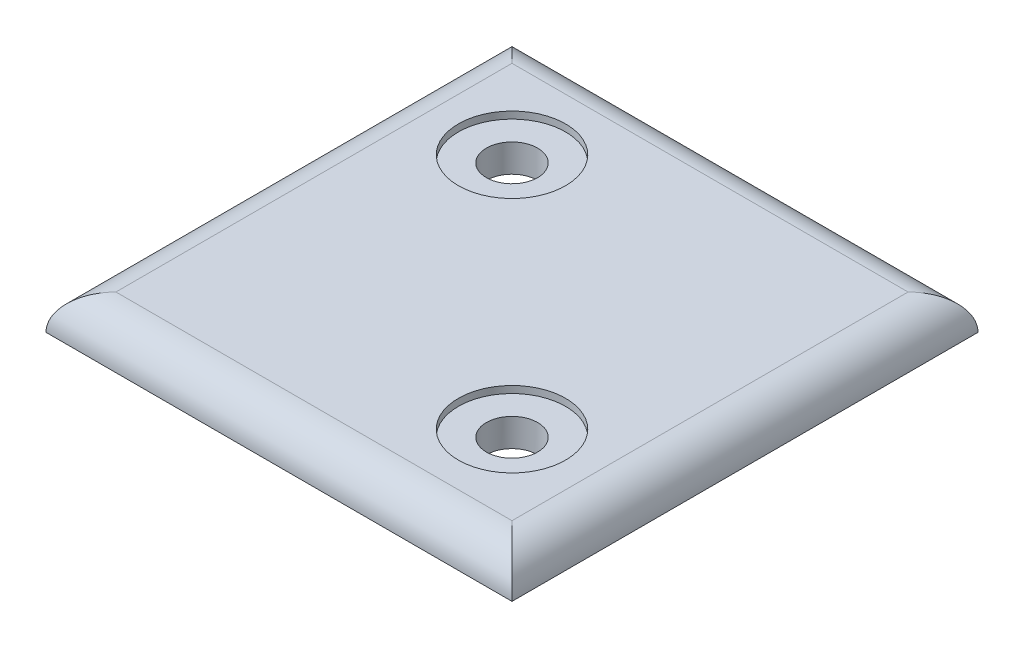
ISO-10303-21;
HEADER;
FILE_DESCRIPTION(('STEP AP214'),'2;1');
FILE_NAME('part.step','',(''),(''),'','','');
FILE_SCHEMA(('AUTOMOTIVE_DESIGN { 1 0 10303 214 1 1 1 1 }'));
ENDSEC;
DATA;
#1=APPLICATION_CONTEXT('core data for automotive mechanical design processes');
#2=APPLICATION_PROTOCOL_DEFINITION('international standard','automotive_design',2000,#1);
#3=PRODUCT_CONTEXT('',#1,'mechanical');
#4=PRODUCT('Part','Part','',(#3));
#5=PRODUCT_RELATED_PRODUCT_CATEGORY('part','',(#4));
#6=PRODUCT_DEFINITION_FORMATION('','',#4);
#7=PRODUCT_DEFINITION_CONTEXT('part definition',#1,'design');
#8=PRODUCT_DEFINITION('design','',#6,#7);
#9=PRODUCT_DEFINITION_SHAPE('','',#8);
#10=(LENGTH_UNIT() NAMED_UNIT(*) SI_UNIT(.MILLI.,.METRE.));
#11=(NAMED_UNIT(*) PLANE_ANGLE_UNIT() SI_UNIT($,.RADIAN.));
#12=(NAMED_UNIT(*) SI_UNIT($,.STERADIAN.) SOLID_ANGLE_UNIT());
#13=UNCERTAINTY_MEASURE_WITH_UNIT(LENGTH_MEASURE(1.E-05),#10,'distance_accuracy_value','');
#14=(GEOMETRIC_REPRESENTATION_CONTEXT(3) GLOBAL_UNCERTAINTY_ASSIGNED_CONTEXT((#13)) GLOBAL_UNIT_ASSIGNED_CONTEXT((#10,
#11,#12)) REPRESENTATION_CONTEXT('',''));
#15=CARTESIAN_POINT('',(0.,0.,0.));
#16=DIRECTION('',(0.,0.,1.));
#17=DIRECTION('',(1.,0.,0.));
#18=AXIS2_PLACEMENT_3D('',#15,#16,#17);
#19=CARTESIAN_POINT('',(10.2,0.,10.2));
#20=DIRECTION('',(0.,1.,0.));
#21=DIRECTION('',(0.,0.,1.));
#22=AXIS2_PLACEMENT_3D('',#19,#20,#21);
#23=CYLINDRICAL_SURFACE('',#22,2.2);
#24=CARTESIAN_POINT('',(10.2,0.,10.2));
#25=DIRECTION('',(0.,1.,0.));
#26=DIRECTION('',(0.,0.,-1.));
#27=AXIS2_PLACEMENT_3D('',#24,#25,#26);
#28=CIRCLE('',#27,2.2);
#29=CARTESIAN_POINT('',(10.2,0.,8.));
#30=VERTEX_POINT('',#29);
#31=EDGE_CURVE('E131',#30,#30,#28,.T.);
#32=ORIENTED_EDGE('',*,*,#31,.F.);
#33=EDGE_LOOP('',(#32));
#34=FACE_BOUND('',#33,.T.);
#35=CARTESIAN_POINT('',(10.2,2.4,10.2));
#36=DIRECTION('',(0.,1.,0.));
#37=DIRECTION('',(0.,0.,1.));
#38=AXIS2_PLACEMENT_3D('',#35,#36,#37);
#39=CIRCLE('',#38,2.2);
#40=CARTESIAN_POINT('',(10.2,2.4,12.4));
#41=VERTEX_POINT('',#40);
#42=EDGE_CURVE('E134',#41,#41,#39,.F.);
#43=ORIENTED_EDGE('',*,*,#42,.F.);
#44=EDGE_LOOP('',(#43));
#45=FACE_BOUND('',#44,.T.);
#46=ADVANCED_FACE('F39',(#34,#45),#23,.F.);
#47=CARTESIAN_POINT('',(-10.2,0.,-10.2));
#48=DIRECTION('',(0.,1.,0.));
#49=DIRECTION('',(0.,0.,1.));
#50=AXIS2_PLACEMENT_3D('',#47,#48,#49);
#51=CYLINDRICAL_SURFACE('',#50,2.2);
#52=CARTESIAN_POINT('',(-10.2,0.,-10.2));
#53=DIRECTION('',(0.,1.,0.));
#54=DIRECTION('',(0.,0.,1.));
#55=AXIS2_PLACEMENT_3D('',#52,#53,#54);
#56=CIRCLE('',#55,2.2);
#57=CARTESIAN_POINT('',(-10.2,0.,-7.99999999999999));
#58=VERTEX_POINT('',#57);
#59=EDGE_CURVE('E101',#58,#58,#56,.T.);
#60=ORIENTED_EDGE('',*,*,#59,.F.);
#61=EDGE_LOOP('',(#60));
#62=FACE_BOUND('',#61,.T.);
#63=CARTESIAN_POINT('',(-10.2,2.4,-10.2));
#64=DIRECTION('',(0.,1.,0.));
#65=DIRECTION('',(0.,0.,1.));
#66=AXIS2_PLACEMENT_3D('',#63,#64,#65);
#67=CIRCLE('',#66,2.2);
#68=CARTESIAN_POINT('',(-10.2,2.4,-7.99999999999999));
#69=VERTEX_POINT('',#68);
#70=EDGE_CURVE('E141',#69,#69,#67,.F.);
#71=ORIENTED_EDGE('',*,*,#70,.F.);
#72=EDGE_LOOP('',(#71));
#73=FACE_BOUND('',#72,.T.);
#74=ADVANCED_FACE('F165',(#62,#73),#51,.F.);
#75=CARTESIAN_POINT('',(0.,3.,0.));
#76=DIRECTION('',(0.,1.,0.));
#77=DIRECTION('',(0.,0.,1.));
#78=AXIS2_PLACEMENT_3D('',#75,#76,#77);
#79=PLANE('',#78);
#80=DIRECTION('',(0.,0.,1.));
#81=VECTOR('',#80,1.);
#82=CARTESIAN_POINT('',(-17.,3.,20.));
#83=LINE('',#82,#81);
#84=CARTESIAN_POINT('',(-17.,3.,-17.));
#85=VERTEX_POINT('',#84);
#86=CARTESIAN_POINT('',(-17.,3.,17.));
#87=VERTEX_POINT('',#86);
#88=EDGE_CURVE('E60',#85,#87,#83,.T.);
#89=ORIENTED_EDGE('',*,*,#88,.T.);
#90=DIRECTION('',(1.,0.,0.));
#91=VECTOR('',#90,1.);
#92=CARTESIAN_POINT('',(20.,3.,17.));
#93=LINE('',#92,#91);
#94=CARTESIAN_POINT('',(17.,3.,17.));
#95=VERTEX_POINT('',#94);
#96=EDGE_CURVE('E11',#87,#95,#93,.T.);
#97=ORIENTED_EDGE('',*,*,#96,.T.);
#98=DIRECTION('',(0.,0.,-1.));
#99=VECTOR('',#98,1.);
#100=CARTESIAN_POINT('',(17.,3.,-20.));
#101=LINE('',#100,#99);
#102=CARTESIAN_POINT('',(17.,3.,-17.));
#103=VERTEX_POINT('',#102);
#104=EDGE_CURVE('E49',#95,#103,#101,.T.);
#105=ORIENTED_EDGE('',*,*,#104,.T.);
#106=DIRECTION('',(-1.,0.,0.));
#107=VECTOR('',#106,1.);
#108=CARTESIAN_POINT('',(-20.,3.,-17.));
#109=LINE('',#108,#107);
#110=EDGE_CURVE('E104',#103,#85,#109,.T.);
#111=ORIENTED_EDGE('',*,*,#110,.T.);
#112=EDGE_LOOP('',(#89,#97,#105,#111));
#113=FACE_BOUND('',#112,.T.);
#114=CARTESIAN_POINT('',(-10.2,3.,-10.2));
#115=DIRECTION('',(0.,1.,0.));
#116=DIRECTION('',(0.,0.,1.));
#117=AXIS2_PLACEMENT_3D('',#114,#115,#116);
#118=CIRCLE('',#117,4.6);
#119=CARTESIAN_POINT('',(-10.2,3.,-5.6));
#120=VERTEX_POINT('',#119);
#121=EDGE_CURVE('E124',#120,#120,#118,.T.);
#122=ORIENTED_EDGE('',*,*,#121,.F.);
#123=EDGE_LOOP('',(#122));
#124=FACE_BOUND('',#123,.T.);
#125=CARTESIAN_POINT('',(10.2,3.,10.2));
#126=DIRECTION('',(0.,1.,0.));
#127=DIRECTION('',(0.,0.,1.));
#128=AXIS2_PLACEMENT_3D('',#125,#126,#127);
#129=CIRCLE('',#128,4.6);
#130=CARTESIAN_POINT('',(10.2,3.,14.8));
#131=VERTEX_POINT('',#130);
#132=EDGE_CURVE('E114',#131,#131,#129,.T.);
#133=ORIENTED_EDGE('',*,*,#132,.F.);
#134=EDGE_LOOP('',(#133));
#135=FACE_BOUND('',#134,.T.);
#136=ADVANCED_FACE('F153',(#113,#124,#135),#79,.T.);
#137=CARTESIAN_POINT('',(0.,0.,0.));
#138=DIRECTION('',(0.,1.,0.));
#139=DIRECTION('',(0.,0.,1.));
#140=AXIS2_PLACEMENT_3D('',#137,#138,#139);
#141=PLANE('',#140);
#142=ORIENTED_EDGE('',*,*,#59,.T.);
#143=EDGE_LOOP('',(#142));
#144=FACE_BOUND('',#143,.T.);
#145=ORIENTED_EDGE('',*,*,#31,.T.);
#146=EDGE_LOOP('',(#145));
#147=FACE_BOUND('',#146,.T.);
#148=DIRECTION('',(0.,0.,-1.));
#149=VECTOR('',#148,1.);
#150=CARTESIAN_POINT('',(20.,0.,-20.));
#151=LINE('',#150,#149);
#152=CARTESIAN_POINT('',(20.,0.,20.));
#153=VERTEX_POINT('',#152);
#154=CARTESIAN_POINT('',(20.,0.,-20.));
#155=VERTEX_POINT('',#154);
#156=EDGE_CURVE('E84',#153,#155,#151,.T.);
#157=ORIENTED_EDGE('',*,*,#156,.F.);
#158=DIRECTION('',(1.,0.,0.));
#159=VECTOR('',#158,1.);
#160=CARTESIAN_POINT('',(-20.,0.,20.));
#161=LINE('',#160,#159);
#162=CARTESIAN_POINT('',(-20.,0.,20.));
#163=VERTEX_POINT('',#162);
#164=EDGE_CURVE('E138',#163,#153,#161,.T.);
#165=ORIENTED_EDGE('',*,*,#164,.F.);
#166=DIRECTION('',(0.,0.,1.));
#167=VECTOR('',#166,1.);
#168=CARTESIAN_POINT('',(-20.,0.,-20.));
#169=LINE('',#168,#167);
#170=CARTESIAN_POINT('',(-20.,0.,-20.));
#171=VERTEX_POINT('',#170);
#172=EDGE_CURVE('E86',#171,#163,#169,.T.);
#173=ORIENTED_EDGE('',*,*,#172,.F.);
#174=DIRECTION('',(-1.,0.,0.));
#175=VECTOR('',#174,1.);
#176=CARTESIAN_POINT('',(-20.,0.,-20.));
#177=LINE('',#176,#175);
#178=EDGE_CURVE('E81',#155,#171,#177,.T.);
#179=ORIENTED_EDGE('',*,*,#178,.F.);
#180=EDGE_LOOP('',(#157,#165,#173,#179));
#181=FACE_BOUND('',#180,.T.);
#182=ADVANCED_FACE('F83',(#144,#147,#181),#141,.F.);
#183=CARTESIAN_POINT('',(-10.2,2.4,-10.2));
#184=DIRECTION('',(0.,1.,0.));
#185=DIRECTION('',(0.,0.,1.));
#186=AXIS2_PLACEMENT_3D('',#183,#184,#185);
#187=PLANE('',#186);
#188=CARTESIAN_POINT('',(-10.2,2.4,-10.2));
#189=DIRECTION('',(0.,1.,0.));
#190=DIRECTION('',(0.,0.,1.));
#191=AXIS2_PLACEMENT_3D('',#188,#189,#190);
#192=CIRCLE('',#191,4.6);
#193=CARTESIAN_POINT('',(-10.2,2.4,-5.6));
#194=VERTEX_POINT('',#193);
#195=EDGE_CURVE('E145',#194,#194,#192,.T.);
#196=ORIENTED_EDGE('',*,*,#195,.T.);
#197=EDGE_LOOP('',(#196));
#198=FACE_BOUND('',#197,.T.);
#199=ORIENTED_EDGE('',*,*,#70,.T.);
#200=EDGE_LOOP('',(#199));
#201=FACE_BOUND('',#200,.T.);
#202=ADVANCED_FACE('F181',(#198,#201),#187,.T.);
#203=CARTESIAN_POINT('',(-10.2,2.4,-10.2));
#204=DIRECTION('',(0.,1.,0.));
#205=DIRECTION('',(0.,0.,1.));
#206=AXIS2_PLACEMENT_3D('',#203,#204,#205);
#207=CYLINDRICAL_SURFACE('',#206,4.6);
#208=ORIENTED_EDGE('',*,*,#195,.F.);
#209=EDGE_LOOP('',(#208));
#210=FACE_BOUND('',#209,.T.);
#211=ORIENTED_EDGE('',*,*,#121,.T.);
#212=EDGE_LOOP('',(#211));
#213=FACE_BOUND('',#212,.T.);
#214=ADVANCED_FACE('F232',(#210,#213),#207,.F.);
#215=CARTESIAN_POINT('',(10.2,2.4,10.2));
#216=DIRECTION('',(0.,1.,0.));
#217=DIRECTION('',(0.,0.,1.));
#218=AXIS2_PLACEMENT_3D('',#215,#216,#217);
#219=PLANE('',#218);
#220=CARTESIAN_POINT('',(10.2,2.4,10.2));
#221=DIRECTION('',(0.,1.,0.));
#222=DIRECTION('',(0.,0.,1.));
#223=AXIS2_PLACEMENT_3D('',#220,#221,#222);
#224=CIRCLE('',#223,4.6);
#225=CARTESIAN_POINT('',(10.2,2.4,14.8));
#226=VERTEX_POINT('',#225);
#227=EDGE_CURVE('E118',#226,#226,#224,.T.);
#228=ORIENTED_EDGE('',*,*,#227,.T.);
#229=EDGE_LOOP('',(#228));
#230=FACE_BOUND('',#229,.T.);
#231=ORIENTED_EDGE('',*,*,#42,.T.);
#232=EDGE_LOOP('',(#231));
#233=FACE_BOUND('',#232,.T.);
#234=ADVANCED_FACE('F223',(#230,#233),#219,.T.);
#235=CARTESIAN_POINT('',(10.2,2.4,10.2));
#236=DIRECTION('',(0.,1.,0.));
#237=DIRECTION('',(0.,0.,1.));
#238=AXIS2_PLACEMENT_3D('',#235,#236,#237);
#239=CYLINDRICAL_SURFACE('',#238,4.6);
#240=ORIENTED_EDGE('',*,*,#227,.F.);
#241=EDGE_LOOP('',(#240));
#242=FACE_BOUND('',#241,.T.);
#243=ORIENTED_EDGE('',*,*,#132,.T.);
#244=EDGE_LOOP('',(#243));
#245=FACE_BOUND('',#244,.T.);
#246=ADVANCED_FACE('F163',(#242,#245),#239,.F.);
#247=CARTESIAN_POINT('',(-17.,0.,0.));
#248=DIRECTION('',(0.,0.,-1.));
#249=DIRECTION('',(-1.,0.,0.));
#250=AXIS2_PLACEMENT_3D('',#247,#248,#249);
#251=CYLINDRICAL_SURFACE('',#250,3.);
#252=CARTESIAN_POINT('',(-17.,0.,-17.));
#253=DIRECTION('',(0.707106781186547,0.,-0.707106781186548));
#254=DIRECTION('',(0.707106781186547,0.,0.707106781186547));
#255=AXIS2_PLACEMENT_3D('',#252,#253,#254);
#256=ELLIPSE('',#255,4.24264068711929,3.);
#257=EDGE_CURVE('E108',#171,#85,#256,.T.);
#258=ORIENTED_EDGE('',*,*,#257,.F.);
#259=ORIENTED_EDGE('',*,*,#172,.T.);
#260=CARTESIAN_POINT('',(-17.,0.,17.));
#261=DIRECTION('',(-0.707106781186547,0.,-0.707106781186547));
#262=DIRECTION('',(-0.707106781186547,0.,0.707106781186548));
#263=AXIS2_PLACEMENT_3D('',#260,#261,#262);
#264=ELLIPSE('',#263,4.24264068711928,3.);
#265=EDGE_CURVE('E43',#87,#163,#264,.F.);
#266=ORIENTED_EDGE('',*,*,#265,.F.);
#267=ORIENTED_EDGE('',*,*,#88,.F.);
#268=EDGE_LOOP('',(#258,#259,#266,#267));
#269=FACE_BOUND('',#268,.T.);
#270=ADVANCED_FACE('F41',(#269),#251,.T.);
#271=CARTESIAN_POINT('',(0.,0.,17.));
#272=DIRECTION('',(-1.,0.,0.));
#273=DIRECTION('',(0.,0.,1.));
#274=AXIS2_PLACEMENT_3D('',#271,#272,#273);
#275=CYLINDRICAL_SURFACE('',#274,3.);
#276=ORIENTED_EDGE('',*,*,#265,.T.);
#277=ORIENTED_EDGE('',*,*,#164,.T.);
#278=CARTESIAN_POINT('',(17.,0.,17.));
#279=DIRECTION('',(-0.707106781186547,0.,0.707106781186548));
#280=DIRECTION('',(-0.707106781186547,0.,-0.707106781186547));
#281=AXIS2_PLACEMENT_3D('',#278,#279,#280);
#282=ELLIPSE('',#281,4.24264068711929,3.);
#283=EDGE_CURVE('E98',#95,#153,#282,.F.);
#284=ORIENTED_EDGE('',*,*,#283,.F.);
#285=ORIENTED_EDGE('',*,*,#96,.F.);
#286=EDGE_LOOP('',(#276,#277,#284,#285));
#287=FACE_BOUND('',#286,.T.);
#288=ADVANCED_FACE('F156',(#287),#275,.T.);
#289=CARTESIAN_POINT('',(0.,0.,-17.));
#290=DIRECTION('',(1.,0.,0.));
#291=DIRECTION('',(0.,0.,-1.));
#292=AXIS2_PLACEMENT_3D('',#289,#290,#291);
#293=CYLINDRICAL_SURFACE('',#292,3.);
#294=ORIENTED_EDGE('',*,*,#257,.T.);
#295=ORIENTED_EDGE('',*,*,#110,.F.);
#296=CARTESIAN_POINT('',(17.,0.,-17.));
#297=DIRECTION('',(0.707106781186547,0.,0.707106781186547));
#298=DIRECTION('',(0.707106781186547,0.,-0.707106781186548));
#299=AXIS2_PLACEMENT_3D('',#296,#297,#298);
#300=ELLIPSE('',#299,4.24264068711928,3.);
#301=EDGE_CURVE('E96',#155,#103,#300,.T.);
#302=ORIENTED_EDGE('',*,*,#301,.F.);
#303=ORIENTED_EDGE('',*,*,#178,.T.);
#304=EDGE_LOOP('',(#294,#295,#302,#303));
#305=FACE_BOUND('',#304,.T.);
#306=ADVANCED_FACE('F103',(#305),#293,.T.);
#307=CARTESIAN_POINT('',(17.,0.,0.));
#308=DIRECTION('',(0.,0.,1.));
#309=DIRECTION('',(1.,0.,0.));
#310=AXIS2_PLACEMENT_3D('',#307,#308,#309);
#311=CYLINDRICAL_SURFACE('',#310,3.);
#312=ORIENTED_EDGE('',*,*,#283,.T.);
#313=ORIENTED_EDGE('',*,*,#156,.T.);
#314=ORIENTED_EDGE('',*,*,#301,.T.);
#315=ORIENTED_EDGE('',*,*,#104,.F.);
#316=EDGE_LOOP('',(#312,#313,#314,#315));
#317=FACE_BOUND('',#316,.T.);
#318=ADVANCED_FACE('F94',(#317),#311,.T.);
#319=CLOSED_SHELL('',(#46,#74,#136,#182,#202,#214,#234,#246,#270,#288,#306,#318));
#320=MANIFOLD_SOLID_BREP('B2',#319);
#321=ADVANCED_BREP_SHAPE_REPRESENTATION('',(#18,#320),#14);
#322=SHAPE_DEFINITION_REPRESENTATION(#9,#321);
ENDSEC;
END-ISO-10303-21;
